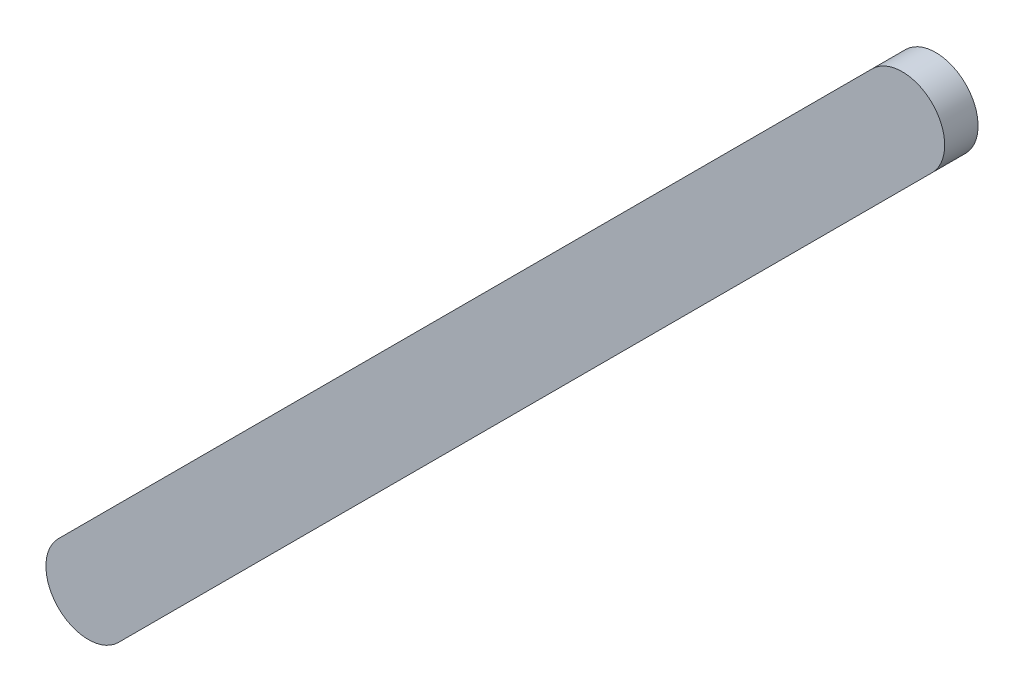
ISO-10303-21;
HEADER;
FILE_DESCRIPTION(('STEP AP214'),'2;1');
FILE_NAME('part.step','',(''),(''),'','','');
FILE_SCHEMA(('AUTOMOTIVE_DESIGN { 1 0 10303 214 1 1 1 1 }'));
ENDSEC;
DATA;
#1=APPLICATION_CONTEXT('core data for automotive mechanical design processes');
#2=APPLICATION_PROTOCOL_DEFINITION('international standard','automotive_design',2000,#1);
#3=PRODUCT_CONTEXT('',#1,'mechanical');
#4=PRODUCT('Part','Part','',(#3));
#5=PRODUCT_RELATED_PRODUCT_CATEGORY('part','',(#4));
#6=PRODUCT_DEFINITION_FORMATION('','',#4);
#7=PRODUCT_DEFINITION_CONTEXT('part definition',#1,'design');
#8=PRODUCT_DEFINITION('design','',#6,#7);
#9=PRODUCT_DEFINITION_SHAPE('','',#8);
#10=(LENGTH_UNIT() NAMED_UNIT(*) SI_UNIT(.MILLI.,.METRE.));
#11=(NAMED_UNIT(*) PLANE_ANGLE_UNIT() SI_UNIT($,.RADIAN.));
#12=(NAMED_UNIT(*) SI_UNIT($,.STERADIAN.) SOLID_ANGLE_UNIT());
#13=UNCERTAINTY_MEASURE_WITH_UNIT(LENGTH_MEASURE(1.E-05),#10,'distance_accuracy_value','');
#14=(GEOMETRIC_REPRESENTATION_CONTEXT(3) GLOBAL_UNCERTAINTY_ASSIGNED_CONTEXT((#13)) GLOBAL_UNIT_ASSIGNED_CONTEXT((#10,
#11,#12)) REPRESENTATION_CONTEXT('',''));
#15=CARTESIAN_POINT('',(0.,0.,0.));
#16=DIRECTION('',(0.,0.,1.));
#17=DIRECTION('',(1.,0.,0.));
#18=AXIS2_PLACEMENT_3D('',#15,#16,#17);
#19=CARTESIAN_POINT('',(140.76860594,56.58939406,0.));
#20=DIRECTION('',(-0.707106781186546,0.707106781186549,0.));
#21=DIRECTION('',(0.707106781186549,0.707106781186546,0.));
#22=AXIS2_PLACEMENT_3D('',#19,#20,#21);
#23=PLANE('',#22);
#24=DIRECTION('',(0.707106781186549,0.707106781186546,0.));
#25=VECTOR('',#24,1.);
#26=CARTESIAN_POINT('',(140.76860594,56.58939406,0.1999996));
#27=LINE('',#26,#25);
#28=CARTESIAN_POINT('',(140.76860594,56.58939406,0.1999996));
#29=VERTEX_POINT('',#28);
#30=CARTESIAN_POINT('',(145.64438994,61.46517806,0.1999996));
#31=VERTEX_POINT('',#30);
#32=EDGE_CURVE('E11',#29,#31,#27,.T.);
#33=ORIENTED_EDGE('',*,*,#32,.F.);
#34=DIRECTION('',(0.,0.,1.));
#35=VECTOR('',#34,1.);
#36=CARTESIAN_POINT('',(140.76860594,56.58939406,0.));
#37=LINE('',#36,#35);
#38=CARTESIAN_POINT('',(140.76860594,56.58939406,0.));
#39=VERTEX_POINT('',#38);
#40=EDGE_CURVE('E24',#39,#29,#37,.T.);
#41=ORIENTED_EDGE('',*,*,#40,.F.);
#42=DIRECTION('',(0.707106781186549,0.707106781186546,0.));
#43=VECTOR('',#42,1.);
#44=CARTESIAN_POINT('',(140.76860594,56.58939406,0.));
#45=LINE('',#44,#43);
#46=CARTESIAN_POINT('',(145.64438994,61.46517806,0.));
#47=VERTEX_POINT('',#46);
#48=EDGE_CURVE('E75',#39,#47,#45,.T.);
#49=ORIENTED_EDGE('',*,*,#48,.T.);
#50=DIRECTION('',(0.,0.,1.));
#51=VECTOR('',#50,1.);
#52=CARTESIAN_POINT('',(145.64438994,61.46517806,0.));
#53=LINE('',#52,#51);
#54=EDGE_CURVE('E37',#47,#31,#53,.T.);
#55=ORIENTED_EDGE('',*,*,#54,.T.);
#56=EDGE_LOOP('',(#33,#41,#49,#55));
#57=FACE_BOUND('',#56,.T.);
#58=ADVANCED_FACE('F17',(#57),#23,.F.);
#59=CARTESIAN_POINT('',(145.464784,61.644784,0.));
#60=DIRECTION('',(0.,0.,-1.));
#61=DIRECTION('',(0.70710678118652,-0.707106781186576,0.));
#62=AXIS2_PLACEMENT_3D('',#59,#60,#61);
#63=CYLINDRICAL_SURFACE('',#62,0.254001156230768);
#64=CARTESIAN_POINT('',(145.464784,61.644784,0.1999996));
#65=DIRECTION('',(0.,0.,1.));
#66=DIRECTION('',(0.70710678118652,-0.707106781186576,0.));
#67=AXIS2_PLACEMENT_3D('',#64,#65,#66);
#68=CIRCLE('',#67,0.254001156230768);
#69=CARTESIAN_POINT('',(145.28517806,61.82438994,0.1999996));
#70=VERTEX_POINT('',#69);
#71=EDGE_CURVE('E83',#31,#70,#68,.T.);
#72=ORIENTED_EDGE('',*,*,#71,.F.);
#73=ORIENTED_EDGE('',*,*,#54,.F.);
#74=CARTESIAN_POINT('',(145.464784,61.644784,0.));
#75=DIRECTION('',(0.,0.,1.));
#76=DIRECTION('',(0.70710678118652,-0.707106781186576,0.));
#77=AXIS2_PLACEMENT_3D('',#74,#75,#76);
#78=CIRCLE('',#77,0.254001156230768);
#79=CARTESIAN_POINT('',(145.28517806,61.82438994,0.));
#80=VERTEX_POINT('',#79);
#81=EDGE_CURVE('E81',#47,#80,#78,.T.);
#82=ORIENTED_EDGE('',*,*,#81,.T.);
#83=DIRECTION('',(0.,0.,1.));
#84=VECTOR('',#83,1.);
#85=CARTESIAN_POINT('',(145.28517806,61.82438994,0.));
#86=LINE('',#85,#84);
#87=EDGE_CURVE('E67',#80,#70,#86,.T.);
#88=ORIENTED_EDGE('',*,*,#87,.T.);
#89=EDGE_LOOP('',(#72,#73,#82,#88));
#90=FACE_BOUND('',#89,.T.);
#91=ADVANCED_FACE('F89',(#90),#63,.T.);
#92=CARTESIAN_POINT('',(145.28517806,61.82438994,0.));
#93=DIRECTION('',(0.707106781186546,-0.707106781186549,0.));
#94=DIRECTION('',(-0.707106781186549,-0.707106781186546,0.));
#95=AXIS2_PLACEMENT_3D('',#92,#93,#94);
#96=PLANE('',#95);
#97=DIRECTION('',(-0.707106781186549,-0.707106781186546,0.));
#98=VECTOR('',#97,1.);
#99=CARTESIAN_POINT('',(145.28517806,61.82438994,0.1999996));
#100=LINE('',#99,#98);
#101=CARTESIAN_POINT('',(140.40939406,56.94860594,0.1999996));
#102=VERTEX_POINT('',#101);
#103=EDGE_CURVE('E71',#70,#102,#100,.T.);
#104=ORIENTED_EDGE('',*,*,#103,.F.);
#105=ORIENTED_EDGE('',*,*,#87,.F.);
#106=DIRECTION('',(-0.707106781186549,-0.707106781186546,0.));
#107=VECTOR('',#106,1.);
#108=CARTESIAN_POINT('',(145.28517806,61.82438994,0.));
#109=LINE('',#108,#107);
#110=CARTESIAN_POINT('',(140.40939406,56.94860594,0.));
#111=VERTEX_POINT('',#110);
#112=EDGE_CURVE('E63',#80,#111,#109,.T.);
#113=ORIENTED_EDGE('',*,*,#112,.T.);
#114=DIRECTION('',(0.,0.,1.));
#115=VECTOR('',#114,1.);
#116=CARTESIAN_POINT('',(140.40939406,56.94860594,0.));
#117=LINE('',#116,#115);
#118=EDGE_CURVE('E53',#111,#102,#117,.T.);
#119=ORIENTED_EDGE('',*,*,#118,.T.);
#120=EDGE_LOOP('',(#104,#105,#113,#119));
#121=FACE_BOUND('',#120,.T.);
#122=ADVANCED_FACE('F66',(#121),#96,.F.);
#123=CARTESIAN_POINT('',(140.589,56.769,0.));
#124=DIRECTION('',(0.,0.,-1.));
#125=DIRECTION('',(-0.707106781186576,0.70710678118652,0.));
#126=AXIS2_PLACEMENT_3D('',#123,#124,#125);
#127=CYLINDRICAL_SURFACE('',#126,0.254001156230774);
#128=CARTESIAN_POINT('',(140.589,56.769,0.1999996));
#129=DIRECTION('',(0.,0.,1.));
#130=DIRECTION('',(-0.707106781186576,0.70710678118652,0.));
#131=AXIS2_PLACEMENT_3D('',#128,#129,#130);
#132=CIRCLE('',#131,0.254001156230774);
#133=EDGE_CURVE('E59',#102,#29,#132,.T.);
#134=ORIENTED_EDGE('',*,*,#133,.F.);
#135=ORIENTED_EDGE('',*,*,#118,.F.);
#136=CARTESIAN_POINT('',(140.589,56.769,0.));
#137=DIRECTION('',(0.,0.,1.));
#138=DIRECTION('',(-0.707106781186576,0.70710678118652,0.));
#139=AXIS2_PLACEMENT_3D('',#136,#137,#138);
#140=CIRCLE('',#139,0.254001156230774);
#141=EDGE_CURVE('E57',#111,#39,#140,.T.);
#142=ORIENTED_EDGE('',*,*,#141,.T.);
#143=ORIENTED_EDGE('',*,*,#40,.T.);
#144=EDGE_LOOP('',(#134,#135,#142,#143));
#145=FACE_BOUND('',#144,.T.);
#146=ADVANCED_FACE('F55',(#145),#127,.T.);
#147=CARTESIAN_POINT('',(140.76860594,56.58939406,0.));
#148=DIRECTION('',(0.,0.,-1.));
#149=DIRECTION('',(-1.,0.,0.));
#150=AXIS2_PLACEMENT_3D('',#147,#148,#149);
#151=PLANE('',#150);
#152=ORIENTED_EDGE('',*,*,#141,.F.);
#153=ORIENTED_EDGE('',*,*,#112,.F.);
#154=ORIENTED_EDGE('',*,*,#81,.F.);
#155=ORIENTED_EDGE('',*,*,#48,.F.);
#156=EDGE_LOOP('',(#152,#153,#154,#155));
#157=FACE_BOUND('',#156,.T.);
#158=ADVANCED_FACE('F74',(#157),#151,.T.);
#159=CARTESIAN_POINT('',(140.76860594,56.58939406,0.1999996));
#160=DIRECTION('',(0.,0.,-1.));
#161=DIRECTION('',(-1.,0.,0.));
#162=AXIS2_PLACEMENT_3D('',#159,#160,#161);
#163=PLANE('',#162);
#164=ORIENTED_EDGE('',*,*,#32,.T.);
#165=ORIENTED_EDGE('',*,*,#71,.T.);
#166=ORIENTED_EDGE('',*,*,#103,.T.);
#167=ORIENTED_EDGE('',*,*,#133,.T.);
#168=EDGE_LOOP('',(#164,#165,#166,#167));
#169=FACE_BOUND('',#168,.T.);
#170=ADVANCED_FACE('F91',(#169),#163,.F.);
#171=CLOSED_SHELL('',(#58,#91,#122,#146,#158,#170));
#172=MANIFOLD_SOLID_BREP('B1',#171);
#173=ADVANCED_BREP_SHAPE_REPRESENTATION('',(#18,#172),#14);
#174=SHAPE_DEFINITION_REPRESENTATION(#9,#173);
ENDSEC;
END-ISO-10303-21;
